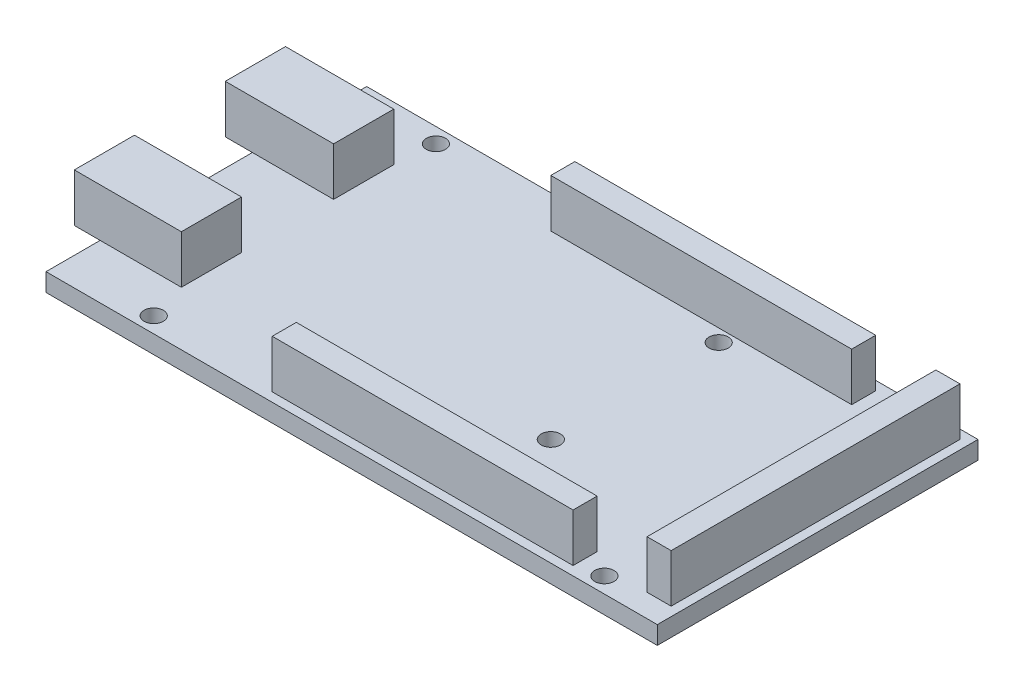
ISO-10303-21;
HEADER;
FILE_DESCRIPTION(('STEP AP214'),'2;1');
FILE_NAME('part.step','',(''),(''),'','','');
FILE_SCHEMA(('AUTOMOTIVE_DESIGN { 1 0 10303 214 1 1 1 1 }'));
ENDSEC;
DATA;
#1=APPLICATION_CONTEXT('core data for automotive mechanical design processes');
#2=APPLICATION_PROTOCOL_DEFINITION('international standard','automotive_design',2000,#1);
#3=PRODUCT_CONTEXT('',#1,'mechanical');
#4=PRODUCT('Part','Part','',(#3));
#5=PRODUCT_RELATED_PRODUCT_CATEGORY('part','',(#4));
#6=PRODUCT_DEFINITION_FORMATION('','',#4);
#7=PRODUCT_DEFINITION_CONTEXT('part definition',#1,'design');
#8=PRODUCT_DEFINITION('design','',#6,#7);
#9=PRODUCT_DEFINITION_SHAPE('','',#8);
#10=(LENGTH_UNIT() NAMED_UNIT(*) SI_UNIT(.MILLI.,.METRE.));
#11=(NAMED_UNIT(*) PLANE_ANGLE_UNIT() SI_UNIT($,.RADIAN.));
#12=(NAMED_UNIT(*) SI_UNIT($,.STERADIAN.) SOLID_ANGLE_UNIT());
#13=UNCERTAINTY_MEASURE_WITH_UNIT(LENGTH_MEASURE(1.E-05),#10,'distance_accuracy_value','');
#14=(GEOMETRIC_REPRESENTATION_CONTEXT(3) GLOBAL_UNCERTAINTY_ASSIGNED_CONTEXT((#13)) GLOBAL_UNIT_ASSIGNED_CONTEXT((#10,
#11,#12)) REPRESENTATION_CONTEXT('',''));
#15=CARTESIAN_POINT('',(0.,0.,0.));
#16=DIRECTION('',(0.,0.,1.));
#17=DIRECTION('',(1.,0.,0.));
#18=AXIS2_PLACEMENT_3D('',#15,#16,#17);
#19=CARTESIAN_POINT('',(0.,3.,0.));
#20=DIRECTION('',(0.,-1.,0.));
#21=DIRECTION('',(0.,0.,-1.));
#22=AXIS2_PLACEMENT_3D('',#19,#20,#21);
#23=PLANE('',#22);
#24=CARTESIAN_POINT('',(14.,3.,-50.8));
#25=DIRECTION('',(0.,-1.,0.));
#26=DIRECTION('',(0.,0.,-1.));
#27=AXIS2_PLACEMENT_3D('',#24,#25,#26);
#28=CIRCLE('',#27,1.59999999999999);
#29=CARTESIAN_POINT('',(14.,3.,-52.4));
#30=VERTEX_POINT('',#29);
#31=EDGE_CURVE('E898',#30,#30,#28,.T.);
#32=ORIENTED_EDGE('',*,*,#31,.T.);
#33=EDGE_LOOP('',(#32));
#34=FACE_BOUND('',#33,.T.);
#35=CARTESIAN_POINT('',(66.1,3.,-45.7));
#36=DIRECTION('',(0.,-1.,0.));
#37=DIRECTION('',(0.,0.,-1.));
#38=AXIS2_PLACEMENT_3D('',#35,#36,#37);
#39=CIRCLE('',#38,1.59999999999999);
#40=CARTESIAN_POINT('',(66.1,3.,-47.3));
#41=VERTEX_POINT('',#40);
#42=EDGE_CURVE('E905',#41,#41,#39,.T.);
#43=ORIENTED_EDGE('',*,*,#42,.T.);
#44=EDGE_LOOP('',(#43));
#45=FACE_BOUND('',#44,.T.);
#46=CARTESIAN_POINT('',(66.1,3.,-17.8));
#47=DIRECTION('',(0.,-1.,0.));
#48=DIRECTION('',(0.,0.,-1.));
#49=AXIS2_PLACEMENT_3D('',#46,#47,#48);
#50=CIRCLE('',#49,1.59999999999999);
#51=CARTESIAN_POINT('',(66.1,3.,-19.4));
#52=VERTEX_POINT('',#51);
#53=EDGE_CURVE('E916',#52,#52,#50,.T.);
#54=ORIENTED_EDGE('',*,*,#53,.T.);
#55=EDGE_LOOP('',(#54));
#56=FACE_BOUND('',#55,.T.);
#57=CARTESIAN_POINT('',(92.7,3.,-50.8));
#58=DIRECTION('',(0.,-1.,0.));
#59=DIRECTION('',(0.,0.,-1.));
#60=AXIS2_PLACEMENT_3D('',#57,#58,#59);
#61=CIRCLE('',#60,1.59999999999999);
#62=CARTESIAN_POINT('',(92.7,3.,-52.4));
#63=VERTEX_POINT('',#62);
#64=EDGE_CURVE('E923',#63,#63,#61,.T.);
#65=ORIENTED_EDGE('',*,*,#64,.T.);
#66=EDGE_LOOP('',(#65));
#67=FACE_BOUND('',#66,.T.);
#68=CARTESIAN_POINT('',(15.3,3.,-2.59999999999999));
#69=DIRECTION('',(0.,-1.,0.));
#70=DIRECTION('',(0.,0.,-1.));
#71=AXIS2_PLACEMENT_3D('',#68,#69,#70);
#72=CIRCLE('',#71,1.6);
#73=CARTESIAN_POINT('',(15.3,3.,-4.19999999999999));
#74=VERTEX_POINT('',#73);
#75=EDGE_CURVE('E43',#74,#74,#72,.T.);
#76=ORIENTED_EDGE('',*,*,#75,.T.);
#77=EDGE_LOOP('',(#76));
#78=FACE_BOUND('',#77,.T.);
#79=CARTESIAN_POINT('',(90.2,3.,-2.59999999999998));
#80=DIRECTION('',(0.,-1.,0.));
#81=DIRECTION('',(0.,0.,-1.));
#82=AXIS2_PLACEMENT_3D('',#79,#80,#81);
#83=CIRCLE('',#82,1.59999999999999);
#84=CARTESIAN_POINT('',(90.2,3.,-4.19999999999997));
#85=VERTEX_POINT('',#84);
#86=EDGE_CURVE('E471',#85,#85,#83,.T.);
#87=ORIENTED_EDGE('',*,*,#86,.T.);
#88=EDGE_LOOP('',(#87));
#89=FACE_BOUND('',#88,.T.);
#90=DIRECTION('',(0.,0.,1.));
#91=VECTOR('',#90,1.);
#92=CARTESIAN_POINT('',(36.1,3.,-5.50000000000002));
#93=LINE('',#92,#91);
#94=CARTESIAN_POINT('',(36.1,3.,-5.50000000000002));
#95=VERTEX_POINT('',#94);
#96=CARTESIAN_POINT('',(36.1,3.,-1.5));
#97=VERTEX_POINT('',#96);
#98=EDGE_CURVE('E244',#95,#97,#93,.T.);
#99=ORIENTED_EDGE('',*,*,#98,.F.);
#100=DIRECTION('',(-1.,0.,0.));
#101=VECTOR('',#100,1.);
#102=CARTESIAN_POINT('',(36.1,3.,-5.50000000000002));
#103=LINE('',#102,#101);
#104=CARTESIAN_POINT('',(86.1,3.,-5.50000000000002));
#105=VERTEX_POINT('',#104);
#106=EDGE_CURVE('E260',#105,#95,#103,.T.);
#107=ORIENTED_EDGE('',*,*,#106,.F.);
#108=DIRECTION('',(0.,0.,-1.));
#109=VECTOR('',#108,1.);
#110=CARTESIAN_POINT('',(86.1,3.,-5.50000000000002));
#111=LINE('',#110,#109);
#112=CARTESIAN_POINT('',(86.1,3.,-1.5));
#113=VERTEX_POINT('',#112);
#114=EDGE_CURVE('E273',#113,#105,#111,.T.);
#115=ORIENTED_EDGE('',*,*,#114,.F.);
#116=DIRECTION('',(1.,0.,0.));
#117=VECTOR('',#116,1.);
#118=CARTESIAN_POINT('',(36.1,3.,-1.5));
#119=LINE('',#118,#117);
#120=EDGE_CURVE('E249',#97,#113,#119,.T.);
#121=ORIENTED_EDGE('',*,*,#120,.F.);
#122=EDGE_LOOP('',(#99,#107,#115,#121));
#123=FACE_BOUND('',#122,.T.);
#124=DIRECTION('',(0.,0.,1.));
#125=VECTOR('',#124,1.);
#126=CARTESIAN_POINT('',(36.1,3.,-51.8));
#127=LINE('',#126,#125);
#128=CARTESIAN_POINT('',(36.1,3.,-51.8));
#129=VERTEX_POINT('',#128);
#130=CARTESIAN_POINT('',(36.1,3.,-47.8));
#131=VERTEX_POINT('',#130);
#132=EDGE_CURVE('E340',#129,#131,#127,.T.);
#133=ORIENTED_EDGE('',*,*,#132,.F.);
#134=DIRECTION('',(-1.,0.,0.));
#135=VECTOR('',#134,1.);
#136=CARTESIAN_POINT('',(36.1,3.,-51.8));
#137=LINE('',#136,#135);
#138=CARTESIAN_POINT('',(86.1,3.,-51.8));
#139=VERTEX_POINT('',#138);
#140=EDGE_CURVE('E346',#139,#129,#137,.T.);
#141=ORIENTED_EDGE('',*,*,#140,.F.);
#142=DIRECTION('',(0.,0.,-1.));
#143=VECTOR('',#142,1.);
#144=CARTESIAN_POINT('',(86.1,3.,-51.8));
#145=LINE('',#144,#143);
#146=CARTESIAN_POINT('',(86.1,3.,-47.8));
#147=VERTEX_POINT('',#146);
#148=EDGE_CURVE('E363',#147,#139,#145,.T.);
#149=ORIENTED_EDGE('',*,*,#148,.F.);
#150=DIRECTION('',(1.,0.,0.));
#151=VECTOR('',#150,1.);
#152=CARTESIAN_POINT('',(36.1,3.,-47.8));
#153=LINE('',#152,#151);
#154=EDGE_CURVE('E359',#131,#147,#153,.T.);
#155=ORIENTED_EDGE('',*,*,#154,.F.);
#156=EDGE_LOOP('',(#133,#141,#149,#155));
#157=FACE_BOUND('',#156,.T.);
#158=DIRECTION('',(0.,0.,1.));
#159=VECTOR('',#158,1.);
#160=CARTESIAN_POINT('',(96.1,3.,-51.8));
#161=LINE('',#160,#159);
#162=CARTESIAN_POINT('',(96.1,3.,-51.8));
#163=VERTEX_POINT('',#162);
#164=CARTESIAN_POINT('',(96.1,3.,-3.8));
#165=VERTEX_POINT('',#164);
#166=EDGE_CURVE('E295',#163,#165,#161,.T.);
#167=ORIENTED_EDGE('',*,*,#166,.F.);
#168=DIRECTION('',(-1.,0.,0.));
#169=VECTOR('',#168,1.);
#170=CARTESIAN_POINT('',(96.1,3.,-51.8));
#171=LINE('',#170,#169);
#172=CARTESIAN_POINT('',(100.1,3.,-51.8));
#173=VERTEX_POINT('',#172);
#174=EDGE_CURVE('E301',#173,#163,#171,.T.);
#175=ORIENTED_EDGE('',*,*,#174,.F.);
#176=DIRECTION('',(0.,0.,-1.));
#177=VECTOR('',#176,1.);
#178=CARTESIAN_POINT('',(100.1,3.,-51.8));
#179=LINE('',#178,#177);
#180=CARTESIAN_POINT('',(100.1,3.,-3.8));
#181=VERTEX_POINT('',#180);
#182=EDGE_CURVE('E318',#181,#173,#179,.T.);
#183=ORIENTED_EDGE('',*,*,#182,.F.);
#184=DIRECTION('',(1.,0.,0.));
#185=VECTOR('',#184,1.);
#186=CARTESIAN_POINT('',(96.1,3.,-3.8));
#187=LINE('',#186,#185);
#188=EDGE_CURVE('E314',#165,#181,#187,.T.);
#189=ORIENTED_EDGE('',*,*,#188,.F.);
#190=EDGE_LOOP('',(#167,#175,#183,#189));
#191=FACE_BOUND('',#190,.T.);
#192=DIRECTION('',(1.,0.,0.));
#193=VECTOR('',#192,1.);
#194=CARTESIAN_POINT('',(-4.29621012064984,3.,-9.));
#195=LINE('',#194,#193);
#196=CARTESIAN_POINT('',(0.,3.,-9.));
#197=VERTEX_POINT('',#196);
#198=CARTESIAN_POINT('',(13.5,3.,-9.));
#199=VERTEX_POINT('',#198);
#200=EDGE_CURVE('E479',#197,#199,#195,.T.);
#201=ORIENTED_EDGE('',*,*,#200,.F.);
#202=DIRECTION('',(0.,0.,1.));
#203=VECTOR('',#202,1.);
#204=CARTESIAN_POINT('',(0.,3.,0.));
#205=LINE('',#204,#203);
#206=CARTESIAN_POINT('',(0.,3.,0.));
#207=VERTEX_POINT('',#206);
#208=EDGE_CURVE('E436',#197,#207,#205,.T.);
#209=ORIENTED_EDGE('',*,*,#208,.T.);
#210=DIRECTION('',(1.,0.,0.));
#211=VECTOR('',#210,1.);
#212=CARTESIAN_POINT('',(0.,3.,0.));
#213=LINE('',#212,#211);
#214=CARTESIAN_POINT('',(101.6,3.,0.));
#215=VERTEX_POINT('',#214);
#216=EDGE_CURVE('E434',#207,#215,#213,.T.);
#217=ORIENTED_EDGE('',*,*,#216,.T.);
#218=DIRECTION('',(0.,0.,-1.));
#219=VECTOR('',#218,1.);
#220=CARTESIAN_POINT('',(101.6,3.,0.));
#221=LINE('',#220,#219);
#222=CARTESIAN_POINT('',(101.6,3.,-53.3));
#223=VERTEX_POINT('',#222);
#224=EDGE_CURVE('E439',#215,#223,#221,.T.);
#225=ORIENTED_EDGE('',*,*,#224,.T.);
#226=DIRECTION('',(-1.,0.,0.));
#227=VECTOR('',#226,1.);
#228=CARTESIAN_POINT('',(0.,3.,-53.3));
#229=LINE('',#228,#227);
#230=CARTESIAN_POINT('',(0.,3.,-53.3));
#231=VERTEX_POINT('',#230);
#232=EDGE_CURVE('E442',#223,#231,#229,.T.);
#233=ORIENTED_EDGE('',*,*,#232,.T.);
#234=CARTESIAN_POINT('',(0.,3.,-44.3));
#235=VERTEX_POINT('',#234);
#236=EDGE_CURVE('E430',#231,#235,#205,.T.);
#237=ORIENTED_EDGE('',*,*,#236,.T.);
#238=DIRECTION('',(-1.,0.,0.));
#239=VECTOR('',#238,1.);
#240=CARTESIAN_POINT('',(-4.50000000000003,3.,-44.3));
#241=LINE('',#240,#239);
#242=CARTESIAN_POINT('',(13.5,3.,-44.3));
#243=VERTEX_POINT('',#242);
#244=EDGE_CURVE('E391',#243,#235,#241,.T.);
#245=ORIENTED_EDGE('',*,*,#244,.F.);
#246=DIRECTION('',(0.,0.,-1.));
#247=VECTOR('',#246,1.);
#248=CARTESIAN_POINT('',(13.5,3.,-44.3));
#249=LINE('',#248,#247);
#250=CARTESIAN_POINT('',(13.5,3.,-34.3));
#251=VERTEX_POINT('',#250);
#252=EDGE_CURVE('E406',#251,#243,#249,.T.);
#253=ORIENTED_EDGE('',*,*,#252,.F.);
#254=DIRECTION('',(1.,0.,0.));
#255=VECTOR('',#254,1.);
#256=CARTESIAN_POINT('',(-4.50000000000002,3.,-34.3));
#257=LINE('',#256,#255);
#258=CARTESIAN_POINT('',(0.,3.,-34.3));
#259=VERTEX_POINT('',#258);
#260=EDGE_CURVE('E11',#259,#251,#257,.T.);
#261=ORIENTED_EDGE('',*,*,#260,.F.);
#262=CARTESIAN_POINT('',(0.,3.,-19.));
#263=VERTEX_POINT('',#262);
#264=EDGE_CURVE('E998',#259,#263,#205,.T.);
#265=ORIENTED_EDGE('',*,*,#264,.T.);
#266=DIRECTION('',(-1.,0.,0.));
#267=VECTOR('',#266,1.);
#268=CARTESIAN_POINT('',(-4.29621012064984,3.,-19.));
#269=LINE('',#268,#267);
#270=CARTESIAN_POINT('',(13.5,3.,-19.));
#271=VERTEX_POINT('',#270);
#272=EDGE_CURVE('E63',#271,#263,#269,.T.);
#273=ORIENTED_EDGE('',*,*,#272,.F.);
#274=DIRECTION('',(0.,0.,-1.));
#275=VECTOR('',#274,1.);
#276=CARTESIAN_POINT('',(13.5,3.,-19.));
#277=LINE('',#276,#275);
#278=EDGE_CURVE('E58',#199,#271,#277,.T.);
#279=ORIENTED_EDGE('',*,*,#278,.F.);
#280=EDGE_LOOP('',(#201,#209,#217,#225,#233,#237,#245,#253,#261,#265,#273,#279));
#281=FACE_BOUND('',#280,.T.);
#282=ADVANCED_FACE('F39',(#34,#45,#56,#67,#78,#89,#123,#157,#191,#281),#23,.F.);
#283=CARTESIAN_POINT('',(0.,3.,0.));
#284=DIRECTION('',(1.,0.,0.));
#285=DIRECTION('',(0.,0.,-1.));
#286=AXIS2_PLACEMENT_3D('',#283,#284,#285);
#287=PLANE('',#286);
#288=DIRECTION('',(0.,0.,1.));
#289=VECTOR('',#288,1.);
#290=CARTESIAN_POINT('',(0.,0.,0.));
#291=LINE('',#290,#289);
#292=CARTESIAN_POINT('',(0.,0.,-53.3));
#293=VERTEX_POINT('',#292);
#294=CARTESIAN_POINT('',(0.,0.,0.));
#295=VERTEX_POINT('',#294);
#296=EDGE_CURVE('E429',#293,#295,#291,.T.);
#297=ORIENTED_EDGE('',*,*,#296,.T.);
#298=DIRECTION('',(0.,-1.,0.));
#299=VECTOR('',#298,1.);
#300=CARTESIAN_POINT('',(0.,3.,0.));
#301=LINE('',#300,#299);
#302=EDGE_CURVE('E49',#207,#295,#301,.T.);
#303=ORIENTED_EDGE('',*,*,#302,.F.);
#304=ORIENTED_EDGE('',*,*,#208,.F.);
#305=EDGE_CURVE('E993',#263,#197,#205,.T.);
#306=ORIENTED_EDGE('',*,*,#305,.F.);
#307=ORIENTED_EDGE('',*,*,#264,.F.);
#308=EDGE_CURVE('E435',#235,#259,#205,.T.);
#309=ORIENTED_EDGE('',*,*,#308,.F.);
#310=ORIENTED_EDGE('',*,*,#236,.F.);
#311=DIRECTION('',(0.,-1.,0.));
#312=VECTOR('',#311,1.);
#313=CARTESIAN_POINT('',(0.,3.,-53.3));
#314=LINE('',#313,#312);
#315=EDGE_CURVE('E445',#231,#293,#314,.T.);
#316=ORIENTED_EDGE('',*,*,#315,.T.);
#317=EDGE_LOOP('',(#297,#303,#304,#306,#307,#309,#310,#316));
#318=FACE_BOUND('',#317,.T.);
#319=ADVANCED_FACE('F41',(#318),#287,.F.);
#320=CARTESIAN_POINT('',(0.,3.,0.));
#321=DIRECTION('',(0.,0.,-1.));
#322=DIRECTION('',(-1.,0.,0.));
#323=AXIS2_PLACEMENT_3D('',#320,#321,#322);
#324=PLANE('',#323);
#325=DIRECTION('',(1.,0.,0.));
#326=VECTOR('',#325,1.);
#327=CARTESIAN_POINT('',(0.,0.,0.));
#328=LINE('',#327,#326);
#329=CARTESIAN_POINT('',(101.6,0.,0.));
#330=VERTEX_POINT('',#329);
#331=EDGE_CURVE('E449',#295,#330,#328,.T.);
#332=ORIENTED_EDGE('',*,*,#331,.T.);
#333=DIRECTION('',(0.,-1.,0.));
#334=VECTOR('',#333,1.);
#335=CARTESIAN_POINT('',(101.6,3.,0.));
#336=LINE('',#335,#334);
#337=EDGE_CURVE('E465',#215,#330,#336,.T.);
#338=ORIENTED_EDGE('',*,*,#337,.F.);
#339=ORIENTED_EDGE('',*,*,#216,.F.);
#340=ORIENTED_EDGE('',*,*,#302,.T.);
#341=EDGE_LOOP('',(#332,#338,#339,#340));
#342=FACE_BOUND('',#341,.T.);
#343=ADVANCED_FACE('F526',(#342),#324,.F.);
#344=CARTESIAN_POINT('',(101.6,3.,0.));
#345=DIRECTION('',(-1.,0.,0.));
#346=DIRECTION('',(0.,0.,1.));
#347=AXIS2_PLACEMENT_3D('',#344,#345,#346);
#348=PLANE('',#347);
#349=DIRECTION('',(0.,0.,-1.));
#350=VECTOR('',#349,1.);
#351=CARTESIAN_POINT('',(101.6,0.,0.));
#352=LINE('',#351,#350);
#353=CARTESIAN_POINT('',(101.6,0.,-53.3));
#354=VERTEX_POINT('',#353);
#355=EDGE_CURVE('E452',#330,#354,#352,.T.);
#356=ORIENTED_EDGE('',*,*,#355,.T.);
#357=DIRECTION('',(0.,-1.,0.));
#358=VECTOR('',#357,1.);
#359=CARTESIAN_POINT('',(101.6,3.,-53.3));
#360=LINE('',#359,#358);
#361=EDGE_CURVE('E461',#223,#354,#360,.T.);
#362=ORIENTED_EDGE('',*,*,#361,.F.);
#363=ORIENTED_EDGE('',*,*,#224,.F.);
#364=ORIENTED_EDGE('',*,*,#337,.T.);
#365=EDGE_LOOP('',(#356,#362,#363,#364));
#366=FACE_BOUND('',#365,.T.);
#367=ADVANCED_FACE('F542',(#366),#348,.F.);
#368=CARTESIAN_POINT('',(0.,3.,-53.3));
#369=DIRECTION('',(0.,0.,1.));
#370=DIRECTION('',(1.,0.,0.));
#371=AXIS2_PLACEMENT_3D('',#368,#369,#370);
#372=PLANE('',#371);
#373=DIRECTION('',(-1.,0.,0.));
#374=VECTOR('',#373,1.);
#375=CARTESIAN_POINT('',(0.,0.,-53.3));
#376=LINE('',#375,#374);
#377=EDGE_CURVE('E455',#354,#293,#376,.T.);
#378=ORIENTED_EDGE('',*,*,#377,.T.);
#379=ORIENTED_EDGE('',*,*,#315,.F.);
#380=ORIENTED_EDGE('',*,*,#232,.F.);
#381=ORIENTED_EDGE('',*,*,#361,.T.);
#382=EDGE_LOOP('',(#378,#379,#380,#381));
#383=FACE_BOUND('',#382,.T.);
#384=ADVANCED_FACE('F538',(#383),#372,.F.);
#385=CARTESIAN_POINT('',(0.,0.,0.));
#386=DIRECTION('',(0.,-1.,0.));
#387=DIRECTION('',(0.,0.,-1.));
#388=AXIS2_PLACEMENT_3D('',#385,#386,#387);
#389=PLANE('',#388);
#390=CARTESIAN_POINT('',(14.,0.,-50.8));
#391=DIRECTION('',(0.,-1.,0.));
#392=DIRECTION('',(0.,0.,-1.));
#393=AXIS2_PLACEMENT_3D('',#390,#391,#392);
#394=CIRCLE('',#393,1.6);
#395=CARTESIAN_POINT('',(14.,0.,-52.4));
#396=VERTEX_POINT('',#395);
#397=EDGE_CURVE('E896',#396,#396,#394,.T.);
#398=ORIENTED_EDGE('',*,*,#397,.F.);
#399=EDGE_LOOP('',(#398));
#400=FACE_BOUND('',#399,.T.);
#401=CARTESIAN_POINT('',(66.1,0.,-45.7));
#402=DIRECTION('',(0.,-1.,0.));
#403=DIRECTION('',(0.,0.,-1.));
#404=AXIS2_PLACEMENT_3D('',#401,#402,#403);
#405=CIRCLE('',#404,1.59999999999999);
#406=CARTESIAN_POINT('',(66.1,0.,-47.3));
#407=VERTEX_POINT('',#406);
#408=EDGE_CURVE('E900',#407,#407,#405,.T.);
#409=ORIENTED_EDGE('',*,*,#408,.F.);
#410=EDGE_LOOP('',(#409));
#411=FACE_BOUND('',#410,.T.);
#412=CARTESIAN_POINT('',(66.1,0.,-17.8));
#413=DIRECTION('',(0.,-1.,0.));
#414=DIRECTION('',(0.,0.,-1.));
#415=AXIS2_PLACEMENT_3D('',#412,#413,#414);
#416=CIRCLE('',#415,1.59999999999999);
#417=CARTESIAN_POINT('',(66.1,0.,-19.4));
#418=VERTEX_POINT('',#417);
#419=EDGE_CURVE('E912',#418,#418,#416,.T.);
#420=ORIENTED_EDGE('',*,*,#419,.F.);
#421=EDGE_LOOP('',(#420));
#422=FACE_BOUND('',#421,.T.);
#423=CARTESIAN_POINT('',(92.7,0.,-50.8));
#424=DIRECTION('',(0.,-1.,0.));
#425=DIRECTION('',(0.,0.,-1.));
#426=AXIS2_PLACEMENT_3D('',#423,#424,#425);
#427=CIRCLE('',#426,1.59999999999999);
#428=CARTESIAN_POINT('',(92.7,0.,-52.4));
#429=VERTEX_POINT('',#428);
#430=EDGE_CURVE('E920',#429,#429,#427,.T.);
#431=ORIENTED_EDGE('',*,*,#430,.F.);
#432=EDGE_LOOP('',(#431));
#433=FACE_BOUND('',#432,.T.);
#434=CARTESIAN_POINT('',(15.3,0.,-2.59999999999999));
#435=DIRECTION('',(0.,-1.,0.));
#436=DIRECTION('',(0.,0.,-1.));
#437=AXIS2_PLACEMENT_3D('',#434,#435,#436);
#438=CIRCLE('',#437,1.6);
#439=CARTESIAN_POINT('',(15.3,0.,-4.19999999999999));
#440=VERTEX_POINT('',#439);
#441=EDGE_CURVE('E487',#440,#440,#438,.T.);
#442=ORIENTED_EDGE('',*,*,#441,.F.);
#443=EDGE_LOOP('',(#442));
#444=FACE_BOUND('',#443,.T.);
#445=CARTESIAN_POINT('',(90.2,0.,-2.59999999999998));
#446=DIRECTION('',(0.,-1.,0.));
#447=DIRECTION('',(0.,0.,-1.));
#448=AXIS2_PLACEMENT_3D('',#445,#446,#447);
#449=CIRCLE('',#448,1.59999999999999);
#450=CARTESIAN_POINT('',(90.2,0.,-4.19999999999997));
#451=VERTEX_POINT('',#450);
#452=EDGE_CURVE('E474',#451,#451,#449,.T.);
#453=ORIENTED_EDGE('',*,*,#452,.F.);
#454=EDGE_LOOP('',(#453));
#455=FACE_BOUND('',#454,.T.);
#456=ORIENTED_EDGE('',*,*,#296,.F.);
#457=ORIENTED_EDGE('',*,*,#377,.F.);
#458=ORIENTED_EDGE('',*,*,#355,.F.);
#459=ORIENTED_EDGE('',*,*,#331,.F.);
#460=EDGE_LOOP('',(#456,#457,#458,#459));
#461=FACE_BOUND('',#460,.T.);
#462=ADVANCED_FACE('F534',(#400,#411,#422,#433,#444,#455,#461),#389,.T.);
#463=CARTESIAN_POINT('',(0.,3.,0.));
#464=DIRECTION('',(0.,1.,0.));
#465=DIRECTION('',(0.,0.,1.));
#466=AXIS2_PLACEMENT_3D('',#463,#464,#465);
#467=PLANE('',#466);
#468=CARTESIAN_POINT('',(-4.50000000000003,3.,-44.3));
#469=VERTEX_POINT('',#468);
#470=EDGE_CURVE('E410',#235,#469,#241,.T.);
#471=ORIENTED_EDGE('',*,*,#470,.F.);
#472=ORIENTED_EDGE('',*,*,#308,.T.);
#473=CARTESIAN_POINT('',(-4.50000000000002,3.,-34.3));
#474=VERTEX_POINT('',#473);
#475=EDGE_CURVE('E51',#474,#259,#257,.T.);
#476=ORIENTED_EDGE('',*,*,#475,.F.);
#477=DIRECTION('',(0.,0.,1.));
#478=VECTOR('',#477,1.);
#479=CARTESIAN_POINT('',(-4.50000000000003,3.,-44.3));
#480=LINE('',#479,#478);
#481=EDGE_CURVE('E385',#469,#474,#480,.T.);
#482=ORIENTED_EDGE('',*,*,#481,.F.);
#483=EDGE_LOOP('',(#471,#472,#476,#482));
#484=FACE_BOUND('',#483,.T.);
#485=ADVANCED_FACE('F537',(#484),#467,.F.);
#486=CARTESIAN_POINT('',(-4.50000000000003,11.,-44.3));
#487=DIRECTION('',(1.,0.,0.));
#488=DIRECTION('',(0.,0.,-1.));
#489=AXIS2_PLACEMENT_3D('',#486,#487,#488);
#490=PLANE('',#489);
#491=ORIENTED_EDGE('',*,*,#481,.T.);
#492=DIRECTION('',(0.,-1.,0.));
#493=VECTOR('',#492,1.);
#494=CARTESIAN_POINT('',(-4.50000000000002,11.,-34.3));
#495=LINE('',#494,#493);
#496=CARTESIAN_POINT('',(-4.50000000000002,11.,-34.3));
#497=VERTEX_POINT('',#496);
#498=EDGE_CURVE('E425',#497,#474,#495,.T.);
#499=ORIENTED_EDGE('',*,*,#498,.F.);
#500=DIRECTION('',(0.,0.,1.));
#501=VECTOR('',#500,1.);
#502=CARTESIAN_POINT('',(-4.50000000000003,11.,-44.3));
#503=LINE('',#502,#501);
#504=CARTESIAN_POINT('',(-4.50000000000003,11.,-44.3));
#505=VERTEX_POINT('',#504);
#506=EDGE_CURVE('E386',#505,#497,#503,.T.);
#507=ORIENTED_EDGE('',*,*,#506,.F.);
#508=DIRECTION('',(0.,-1.,0.));
#509=VECTOR('',#508,1.);
#510=CARTESIAN_POINT('',(-4.50000000000003,11.,-44.3));
#511=LINE('',#510,#509);
#512=EDGE_CURVE('E400',#505,#469,#511,.T.);
#513=ORIENTED_EDGE('',*,*,#512,.T.);
#514=EDGE_LOOP('',(#491,#499,#507,#513));
#515=FACE_BOUND('',#514,.T.);
#516=ADVANCED_FACE('F532',(#515),#490,.F.);
#517=CARTESIAN_POINT('',(-4.50000000000002,11.,-34.3));
#518=DIRECTION('',(0.,0.,-1.));
#519=DIRECTION('',(-1.,0.,0.));
#520=AXIS2_PLACEMENT_3D('',#517,#518,#519);
#521=PLANE('',#520);
#522=ORIENTED_EDGE('',*,*,#475,.T.);
#523=ORIENTED_EDGE('',*,*,#260,.T.);
#524=DIRECTION('',(0.,-1.,0.));
#525=VECTOR('',#524,1.);
#526=CARTESIAN_POINT('',(13.5,11.,-34.3));
#527=LINE('',#526,#525);
#528=CARTESIAN_POINT('',(13.5,11.,-34.3));
#529=VERTEX_POINT('',#528);
#530=EDGE_CURVE('E421',#529,#251,#527,.T.);
#531=ORIENTED_EDGE('',*,*,#530,.F.);
#532=DIRECTION('',(1.,0.,0.));
#533=VECTOR('',#532,1.);
#534=CARTESIAN_POINT('',(-4.50000000000002,11.,-34.3));
#535=LINE('',#534,#533);
#536=EDGE_CURVE('E390',#497,#529,#535,.T.);
#537=ORIENTED_EDGE('',*,*,#536,.F.);
#538=ORIENTED_EDGE('',*,*,#498,.T.);
#539=EDGE_LOOP('',(#522,#523,#531,#537,#538));
#540=FACE_BOUND('',#539,.T.);
#541=ADVANCED_FACE('F578',(#540),#521,.F.);
#542=CARTESIAN_POINT('',(13.5,11.,-44.3));
#543=DIRECTION('',(-1.,0.,0.));
#544=DIRECTION('',(0.,0.,1.));
#545=AXIS2_PLACEMENT_3D('',#542,#543,#544);
#546=PLANE('',#545);
#547=ORIENTED_EDGE('',*,*,#252,.T.);
#548=DIRECTION('',(0.,-1.,0.));
#549=VECTOR('',#548,1.);
#550=CARTESIAN_POINT('',(13.5,11.,-44.3));
#551=LINE('',#550,#549);
#552=CARTESIAN_POINT('',(13.5,11.,-44.3));
#553=VERTEX_POINT('',#552);
#554=EDGE_CURVE('E417',#553,#243,#551,.T.);
#555=ORIENTED_EDGE('',*,*,#554,.F.);
#556=DIRECTION('',(0.,0.,-1.));
#557=VECTOR('',#556,1.);
#558=CARTESIAN_POINT('',(13.5,11.,-44.3));
#559=LINE('',#558,#557);
#560=EDGE_CURVE('E394',#529,#553,#559,.T.);
#561=ORIENTED_EDGE('',*,*,#560,.F.);
#562=ORIENTED_EDGE('',*,*,#530,.T.);
#563=EDGE_LOOP('',(#547,#555,#561,#562));
#564=FACE_BOUND('',#563,.T.);
#565=ADVANCED_FACE('F575',(#564),#546,.F.);
#566=CARTESIAN_POINT('',(-4.50000000000003,11.,-44.3));
#567=DIRECTION('',(0.,0.,1.));
#568=DIRECTION('',(1.,0.,0.));
#569=AXIS2_PLACEMENT_3D('',#566,#567,#568);
#570=PLANE('',#569);
#571=ORIENTED_EDGE('',*,*,#244,.T.);
#572=ORIENTED_EDGE('',*,*,#470,.T.);
#573=ORIENTED_EDGE('',*,*,#512,.F.);
#574=DIRECTION('',(-1.,0.,0.));
#575=VECTOR('',#574,1.);
#576=CARTESIAN_POINT('',(-4.50000000000003,11.,-44.3));
#577=LINE('',#576,#575);
#578=EDGE_CURVE('E397',#553,#505,#577,.T.);
#579=ORIENTED_EDGE('',*,*,#578,.F.);
#580=ORIENTED_EDGE('',*,*,#554,.T.);
#581=EDGE_LOOP('',(#571,#572,#573,#579,#580));
#582=FACE_BOUND('',#581,.T.);
#583=ADVANCED_FACE('F570',(#582),#570,.F.);
#584=CARTESIAN_POINT('',(0.,11.,0.));
#585=DIRECTION('',(0.,1.,0.));
#586=DIRECTION('',(0.,0.,1.));
#587=AXIS2_PLACEMENT_3D('',#584,#585,#586);
#588=PLANE('',#587);
#589=ORIENTED_EDGE('',*,*,#506,.T.);
#590=ORIENTED_EDGE('',*,*,#536,.T.);
#591=ORIENTED_EDGE('',*,*,#560,.T.);
#592=ORIENTED_EDGE('',*,*,#578,.T.);
#593=EDGE_LOOP('',(#589,#590,#591,#592));
#594=FACE_BOUND('',#593,.T.);
#595=ADVANCED_FACE('F583',(#594),#588,.T.);
#596=CARTESIAN_POINT('',(36.1,11.,-51.8));
#597=DIRECTION('',(1.,0.,0.));
#598=DIRECTION('',(0.,0.,-1.));
#599=AXIS2_PLACEMENT_3D('',#596,#597,#598);
#600=PLANE('',#599);
#601=ORIENTED_EDGE('',*,*,#132,.T.);
#602=DIRECTION('',(0.,-1.,0.));
#603=VECTOR('',#602,1.);
#604=CARTESIAN_POINT('',(36.1,11.,-47.8));
#605=LINE('',#604,#603);
#606=CARTESIAN_POINT('',(36.1,11.,-47.8));
#607=VERTEX_POINT('',#606);
#608=EDGE_CURVE('E381',#607,#131,#605,.T.);
#609=ORIENTED_EDGE('',*,*,#608,.F.);
#610=DIRECTION('',(0.,0.,1.));
#611=VECTOR('',#610,1.);
#612=CARTESIAN_POINT('',(36.1,11.,-51.8));
#613=LINE('',#612,#611);
#614=CARTESIAN_POINT('',(36.1,11.,-51.8));
#615=VERTEX_POINT('',#614);
#616=EDGE_CURVE('E341',#615,#607,#613,.T.);
#617=ORIENTED_EDGE('',*,*,#616,.F.);
#618=DIRECTION('',(0.,-1.,0.));
#619=VECTOR('',#618,1.);
#620=CARTESIAN_POINT('',(36.1,11.,-51.8));
#621=LINE('',#620,#619);
#622=EDGE_CURVE('E355',#615,#129,#621,.T.);
#623=ORIENTED_EDGE('',*,*,#622,.T.);
#624=EDGE_LOOP('',(#601,#609,#617,#623));
#625=FACE_BOUND('',#624,.T.);
#626=ADVANCED_FACE('F585',(#625),#600,.F.);
#627=CARTESIAN_POINT('',(36.1,11.,-47.8));
#628=DIRECTION('',(0.,0.,-1.));
#629=DIRECTION('',(-1.,0.,0.));
#630=AXIS2_PLACEMENT_3D('',#627,#628,#629);
#631=PLANE('',#630);
#632=ORIENTED_EDGE('',*,*,#154,.T.);
#633=DIRECTION('',(0.,-1.,0.));
#634=VECTOR('',#633,1.);
#635=CARTESIAN_POINT('',(86.1,11.,-47.8));
#636=LINE('',#635,#634);
#637=CARTESIAN_POINT('',(86.1,11.,-47.8));
#638=VERTEX_POINT('',#637);
#639=EDGE_CURVE('E377',#638,#147,#636,.T.);
#640=ORIENTED_EDGE('',*,*,#639,.F.);
#641=DIRECTION('',(1.,0.,0.));
#642=VECTOR('',#641,1.);
#643=CARTESIAN_POINT('',(36.1,11.,-47.8));
#644=LINE('',#643,#642);
#645=EDGE_CURVE('E345',#607,#638,#644,.T.);
#646=ORIENTED_EDGE('',*,*,#645,.F.);
#647=ORIENTED_EDGE('',*,*,#608,.T.);
#648=EDGE_LOOP('',(#632,#640,#646,#647));
#649=FACE_BOUND('',#648,.T.);
#650=ADVANCED_FACE('F591',(#649),#631,.F.);
#651=CARTESIAN_POINT('',(86.1,11.,-51.8));
#652=DIRECTION('',(-1.,0.,0.));
#653=DIRECTION('',(0.,0.,1.));
#654=AXIS2_PLACEMENT_3D('',#651,#652,#653);
#655=PLANE('',#654);
#656=ORIENTED_EDGE('',*,*,#148,.T.);
#657=DIRECTION('',(0.,-1.,0.));
#658=VECTOR('',#657,1.);
#659=CARTESIAN_POINT('',(86.1,11.,-51.8));
#660=LINE('',#659,#658);
#661=CARTESIAN_POINT('',(86.1,11.,-51.8));
#662=VERTEX_POINT('',#661);
#663=EDGE_CURVE('E373',#662,#139,#660,.T.);
#664=ORIENTED_EDGE('',*,*,#663,.F.);
#665=DIRECTION('',(0.,0.,-1.));
#666=VECTOR('',#665,1.);
#667=CARTESIAN_POINT('',(86.1,11.,-51.8));
#668=LINE('',#667,#666);
#669=EDGE_CURVE('E349',#638,#662,#668,.T.);
#670=ORIENTED_EDGE('',*,*,#669,.F.);
#671=ORIENTED_EDGE('',*,*,#639,.T.);
#672=EDGE_LOOP('',(#656,#664,#670,#671));
#673=FACE_BOUND('',#672,.T.);
#674=ADVANCED_FACE('F679',(#673),#655,.F.);
#675=CARTESIAN_POINT('',(36.1,11.,-51.8));
#676=DIRECTION('',(0.,0.,1.));
#677=DIRECTION('',(1.,0.,0.));
#678=AXIS2_PLACEMENT_3D('',#675,#676,#677);
#679=PLANE('',#678);
#680=ORIENTED_EDGE('',*,*,#140,.T.);
#681=ORIENTED_EDGE('',*,*,#622,.F.);
#682=DIRECTION('',(-1.,0.,0.));
#683=VECTOR('',#682,1.);
#684=CARTESIAN_POINT('',(36.1,11.,-51.8));
#685=LINE('',#684,#683);
#686=EDGE_CURVE('E352',#662,#615,#685,.T.);
#687=ORIENTED_EDGE('',*,*,#686,.F.);
#688=ORIENTED_EDGE('',*,*,#663,.T.);
#689=EDGE_LOOP('',(#680,#681,#687,#688));
#690=FACE_BOUND('',#689,.T.);
#691=ADVANCED_FACE('F687',(#690),#679,.F.);
#692=CARTESIAN_POINT('',(0.,11.,0.));
#693=DIRECTION('',(0.,1.,0.));
#694=DIRECTION('',(0.,0.,1.));
#695=AXIS2_PLACEMENT_3D('',#692,#693,#694);
#696=PLANE('',#695);
#697=ORIENTED_EDGE('',*,*,#616,.T.);
#698=ORIENTED_EDGE('',*,*,#645,.T.);
#699=ORIENTED_EDGE('',*,*,#669,.T.);
#700=ORIENTED_EDGE('',*,*,#686,.T.);
#701=EDGE_LOOP('',(#697,#698,#699,#700));
#702=FACE_BOUND('',#701,.T.);
#703=ADVANCED_FACE('F696',(#702),#696,.T.);
#704=CARTESIAN_POINT('',(96.1,11.,-51.8));
#705=DIRECTION('',(1.,0.,0.));
#706=DIRECTION('',(0.,0.,-1.));
#707=AXIS2_PLACEMENT_3D('',#704,#705,#706);
#708=PLANE('',#707);
#709=ORIENTED_EDGE('',*,*,#166,.T.);
#710=DIRECTION('',(0.,-1.,0.));
#711=VECTOR('',#710,1.);
#712=CARTESIAN_POINT('',(96.1,11.,-3.8));
#713=LINE('',#712,#711);
#714=CARTESIAN_POINT('',(96.1,11.,-3.8));
#715=VERTEX_POINT('',#714);
#716=EDGE_CURVE('E336',#715,#165,#713,.T.);
#717=ORIENTED_EDGE('',*,*,#716,.F.);
#718=DIRECTION('',(0.,0.,1.));
#719=VECTOR('',#718,1.);
#720=CARTESIAN_POINT('',(96.1,11.,-51.8));
#721=LINE('',#720,#719);
#722=CARTESIAN_POINT('',(96.1,11.,-51.8));
#723=VERTEX_POINT('',#722);
#724=EDGE_CURVE('E296',#723,#715,#721,.T.);
#725=ORIENTED_EDGE('',*,*,#724,.F.);
#726=DIRECTION('',(0.,-1.,0.));
#727=VECTOR('',#726,1.);
#728=CARTESIAN_POINT('',(96.1,11.,-51.8));
#729=LINE('',#728,#727);
#730=EDGE_CURVE('E310',#723,#163,#729,.T.);
#731=ORIENTED_EDGE('',*,*,#730,.T.);
#732=EDGE_LOOP('',(#709,#717,#725,#731));
#733=FACE_BOUND('',#732,.T.);
#734=ADVANCED_FACE('F705',(#733),#708,.F.);
#735=CARTESIAN_POINT('',(96.1,11.,-3.8));
#736=DIRECTION('',(0.,0.,-1.));
#737=DIRECTION('',(-1.,0.,0.));
#738=AXIS2_PLACEMENT_3D('',#735,#736,#737);
#739=PLANE('',#738);
#740=ORIENTED_EDGE('',*,*,#188,.T.);
#741=DIRECTION('',(0.,-1.,0.));
#742=VECTOR('',#741,1.);
#743=CARTESIAN_POINT('',(100.1,11.,-3.8));
#744=LINE('',#743,#742);
#745=CARTESIAN_POINT('',(100.1,11.,-3.8));
#746=VERTEX_POINT('',#745);
#747=EDGE_CURVE('E332',#746,#181,#744,.T.);
#748=ORIENTED_EDGE('',*,*,#747,.F.);
#749=DIRECTION('',(1.,0.,0.));
#750=VECTOR('',#749,1.);
#751=CARTESIAN_POINT('',(96.1,11.,-3.8));
#752=LINE('',#751,#750);
#753=EDGE_CURVE('E300',#715,#746,#752,.T.);
#754=ORIENTED_EDGE('',*,*,#753,.F.);
#755=ORIENTED_EDGE('',*,*,#716,.T.);
#756=EDGE_LOOP('',(#740,#748,#754,#755));
#757=FACE_BOUND('',#756,.T.);
#758=ADVANCED_FACE('F714',(#757),#739,.F.);
#759=CARTESIAN_POINT('',(100.1,11.,-51.8));
#760=DIRECTION('',(-1.,0.,0.));
#761=DIRECTION('',(0.,0.,1.));
#762=AXIS2_PLACEMENT_3D('',#759,#760,#761);
#763=PLANE('',#762);
#764=ORIENTED_EDGE('',*,*,#182,.T.);
#765=DIRECTION('',(0.,-1.,0.));
#766=VECTOR('',#765,1.);
#767=CARTESIAN_POINT('',(100.1,11.,-51.8));
#768=LINE('',#767,#766);
#769=CARTESIAN_POINT('',(100.1,11.,-51.8));
#770=VERTEX_POINT('',#769);
#771=EDGE_CURVE('E328',#770,#173,#768,.T.);
#772=ORIENTED_EDGE('',*,*,#771,.F.);
#773=DIRECTION('',(0.,0.,-1.));
#774=VECTOR('',#773,1.);
#775=CARTESIAN_POINT('',(100.1,11.,-51.8));
#776=LINE('',#775,#774);
#777=EDGE_CURVE('E304',#746,#770,#776,.T.);
#778=ORIENTED_EDGE('',*,*,#777,.F.);
#779=ORIENTED_EDGE('',*,*,#747,.T.);
#780=EDGE_LOOP('',(#764,#772,#778,#779));
#781=FACE_BOUND('',#780,.T.);
#782=ADVANCED_FACE('F723',(#781),#763,.F.);
#783=CARTESIAN_POINT('',(96.1,11.,-51.8));
#784=DIRECTION('',(0.,0.,1.));
#785=DIRECTION('',(1.,0.,0.));
#786=AXIS2_PLACEMENT_3D('',#783,#784,#785);
#787=PLANE('',#786);
#788=ORIENTED_EDGE('',*,*,#174,.T.);
#789=ORIENTED_EDGE('',*,*,#730,.F.);
#790=DIRECTION('',(-1.,0.,0.));
#791=VECTOR('',#790,1.);
#792=CARTESIAN_POINT('',(96.1,11.,-51.8));
#793=LINE('',#792,#791);
#794=EDGE_CURVE('E307',#770,#723,#793,.T.);
#795=ORIENTED_EDGE('',*,*,#794,.F.);
#796=ORIENTED_EDGE('',*,*,#771,.T.);
#797=EDGE_LOOP('',(#788,#789,#795,#796));
#798=FACE_BOUND('',#797,.T.);
#799=ADVANCED_FACE('F732',(#798),#787,.F.);
#800=CARTESIAN_POINT('',(0.,11.,0.));
#801=DIRECTION('',(0.,1.,0.));
#802=DIRECTION('',(0.,0.,1.));
#803=AXIS2_PLACEMENT_3D('',#800,#801,#802);
#804=PLANE('',#803);
#805=ORIENTED_EDGE('',*,*,#724,.T.);
#806=ORIENTED_EDGE('',*,*,#753,.T.);
#807=ORIENTED_EDGE('',*,*,#777,.T.);
#808=ORIENTED_EDGE('',*,*,#794,.T.);
#809=EDGE_LOOP('',(#805,#806,#807,#808));
#810=FACE_BOUND('',#809,.T.);
#811=ADVANCED_FACE('F741',(#810),#804,.T.);
#812=CARTESIAN_POINT('',(36.1,11.,-5.50000000000002));
#813=DIRECTION('',(1.,0.,0.));
#814=DIRECTION('',(0.,0.,-1.));
#815=AXIS2_PLACEMENT_3D('',#812,#813,#814);
#816=PLANE('',#815);
#817=ORIENTED_EDGE('',*,*,#98,.T.);
#818=DIRECTION('',(0.,-1.,0.));
#819=VECTOR('',#818,1.);
#820=CARTESIAN_POINT('',(36.1,11.,-1.5));
#821=LINE('',#820,#819);
#822=CARTESIAN_POINT('',(36.1,11.,-1.5));
#823=VERTEX_POINT('',#822);
#824=EDGE_CURVE('E291',#823,#97,#821,.T.);
#825=ORIENTED_EDGE('',*,*,#824,.F.);
#826=DIRECTION('',(0.,0.,1.));
#827=VECTOR('',#826,1.);
#828=CARTESIAN_POINT('',(36.1,11.,-5.50000000000002));
#829=LINE('',#828,#827);
#830=CARTESIAN_POINT('',(36.1,11.,-5.50000000000002));
#831=VERTEX_POINT('',#830);
#832=EDGE_CURVE('E255',#831,#823,#829,.T.);
#833=ORIENTED_EDGE('',*,*,#832,.F.);
#834=DIRECTION('',(0.,-1.,0.));
#835=VECTOR('',#834,1.);
#836=CARTESIAN_POINT('',(36.1,11.,-5.50000000000002));
#837=LINE('',#836,#835);
#838=EDGE_CURVE('E268',#831,#95,#837,.T.);
#839=ORIENTED_EDGE('',*,*,#838,.T.);
#840=EDGE_LOOP('',(#817,#825,#833,#839));
#841=FACE_BOUND('',#840,.T.);
#842=ADVANCED_FACE('F750',(#841),#816,.F.);
#843=CARTESIAN_POINT('',(36.1,11.,-1.5));
#844=DIRECTION('',(0.,0.,-1.));
#845=DIRECTION('',(-1.,0.,0.));
#846=AXIS2_PLACEMENT_3D('',#843,#844,#845);
#847=PLANE('',#846);
#848=ORIENTED_EDGE('',*,*,#120,.T.);
#849=DIRECTION('',(0.,-1.,0.));
#850=VECTOR('',#849,1.);
#851=CARTESIAN_POINT('',(86.1,11.,-1.5));
#852=LINE('',#851,#850);
#853=CARTESIAN_POINT('',(86.1,11.,-1.5));
#854=VERTEX_POINT('',#853);
#855=EDGE_CURVE('E287',#854,#113,#852,.T.);
#856=ORIENTED_EDGE('',*,*,#855,.F.);
#857=DIRECTION('',(1.,0.,0.));
#858=VECTOR('',#857,1.);
#859=CARTESIAN_POINT('',(36.1,11.,-1.5));
#860=LINE('',#859,#858);
#861=EDGE_CURVE('E259',#823,#854,#860,.T.);
#862=ORIENTED_EDGE('',*,*,#861,.F.);
#863=ORIENTED_EDGE('',*,*,#824,.T.);
#864=EDGE_LOOP('',(#848,#856,#862,#863));
#865=FACE_BOUND('',#864,.T.);
#866=ADVANCED_FACE('F759',(#865),#847,.F.);
#867=CARTESIAN_POINT('',(86.1,11.,-5.50000000000002));
#868=DIRECTION('',(-1.,0.,0.));
#869=DIRECTION('',(0.,0.,1.));
#870=AXIS2_PLACEMENT_3D('',#867,#868,#869);
#871=PLANE('',#870);
#872=ORIENTED_EDGE('',*,*,#114,.T.);
#873=DIRECTION('',(0.,-1.,0.));
#874=VECTOR('',#873,1.);
#875=CARTESIAN_POINT('',(86.1,11.,-5.50000000000002));
#876=LINE('',#875,#874);
#877=CARTESIAN_POINT('',(86.1,11.,-5.50000000000002));
#878=VERTEX_POINT('',#877);
#879=EDGE_CURVE('E283',#878,#105,#876,.T.);
#880=ORIENTED_EDGE('',*,*,#879,.F.);
#881=DIRECTION('',(0.,0.,-1.));
#882=VECTOR('',#881,1.);
#883=CARTESIAN_POINT('',(86.1,11.,-5.50000000000002));
#884=LINE('',#883,#882);
#885=EDGE_CURVE('E263',#854,#878,#884,.T.);
#886=ORIENTED_EDGE('',*,*,#885,.F.);
#887=ORIENTED_EDGE('',*,*,#855,.T.);
#888=EDGE_LOOP('',(#872,#880,#886,#887));
#889=FACE_BOUND('',#888,.T.);
#890=ADVANCED_FACE('F768',(#889),#871,.F.);
#891=CARTESIAN_POINT('',(36.1,11.,-5.50000000000002));
#892=DIRECTION('',(0.,0.,1.));
#893=DIRECTION('',(1.,0.,0.));
#894=AXIS2_PLACEMENT_3D('',#891,#892,#893);
#895=PLANE('',#894);
#896=ORIENTED_EDGE('',*,*,#106,.T.);
#897=ORIENTED_EDGE('',*,*,#838,.F.);
#898=DIRECTION('',(-1.,0.,0.));
#899=VECTOR('',#898,1.);
#900=CARTESIAN_POINT('',(36.1,11.,-5.50000000000002));
#901=LINE('',#900,#899);
#902=EDGE_CURVE('E266',#878,#831,#901,.T.);
#903=ORIENTED_EDGE('',*,*,#902,.F.);
#904=ORIENTED_EDGE('',*,*,#879,.T.);
#905=EDGE_LOOP('',(#896,#897,#903,#904));
#906=FACE_BOUND('',#905,.T.);
#907=ADVANCED_FACE('F777',(#906),#895,.F.);
#908=CARTESIAN_POINT('',(0.,11.,0.));
#909=DIRECTION('',(0.,1.,0.));
#910=DIRECTION('',(0.,0.,1.));
#911=AXIS2_PLACEMENT_3D('',#908,#909,#910);
#912=PLANE('',#911);
#913=ORIENTED_EDGE('',*,*,#832,.T.);
#914=ORIENTED_EDGE('',*,*,#861,.T.);
#915=ORIENTED_EDGE('',*,*,#885,.T.);
#916=ORIENTED_EDGE('',*,*,#902,.T.);
#917=EDGE_LOOP('',(#913,#914,#915,#916));
#918=FACE_BOUND('',#917,.T.);
#919=ADVANCED_FACE('F786',(#918),#912,.T.);
#920=CARTESIAN_POINT('',(0.,3.,0.));
#921=DIRECTION('',(0.,1.,0.));
#922=DIRECTION('',(0.,0.,1.));
#923=AXIS2_PLACEMENT_3D('',#920,#921,#922);
#924=PLANE('',#923);
#925=CARTESIAN_POINT('',(-4.29621012064984,3.,-19.));
#926=VERTEX_POINT('',#925);
#927=EDGE_CURVE('E501',#263,#926,#269,.T.);
#928=ORIENTED_EDGE('',*,*,#927,.F.);
#929=ORIENTED_EDGE('',*,*,#305,.T.);
#930=CARTESIAN_POINT('',(-4.29621012064984,3.,-9.));
#931=VERTEX_POINT('',#930);
#932=EDGE_CURVE('E496',#931,#197,#195,.T.);
#933=ORIENTED_EDGE('',*,*,#932,.F.);
#934=DIRECTION('',(0.,0.,1.));
#935=VECTOR('',#934,1.);
#936=CARTESIAN_POINT('',(-4.29621012064984,3.,-19.));
#937=LINE('',#936,#935);
#938=EDGE_CURVE('E242',#926,#931,#937,.T.);
#939=ORIENTED_EDGE('',*,*,#938,.F.);
#940=EDGE_LOOP('',(#928,#929,#933,#939));
#941=FACE_BOUND('',#940,.T.);
#942=ADVANCED_FACE('F795',(#941),#924,.F.);
#943=CARTESIAN_POINT('',(-4.29621012064984,11.,-19.));
#944=DIRECTION('',(1.,0.,0.));
#945=DIRECTION('',(0.,0.,-1.));
#946=AXIS2_PLACEMENT_3D('',#943,#944,#945);
#947=PLANE('',#946);
#948=ORIENTED_EDGE('',*,*,#938,.T.);
#949=DIRECTION('',(0.,-1.,0.));
#950=VECTOR('',#949,1.);
#951=CARTESIAN_POINT('',(-4.29621012064984,11.,-9.));
#952=LINE('',#951,#950);
#953=CARTESIAN_POINT('',(-4.29621012064984,11.,-9.));
#954=VERTEX_POINT('',#953);
#955=EDGE_CURVE('E221',#954,#931,#952,.T.);
#956=ORIENTED_EDGE('',*,*,#955,.F.);
#957=DIRECTION('',(0.,0.,1.));
#958=VECTOR('',#957,1.);
#959=CARTESIAN_POINT('',(-4.29621012064984,11.,-19.));
#960=LINE('',#959,#958);
#961=CARTESIAN_POINT('',(-4.29621012064984,11.,-19.));
#962=VERTEX_POINT('',#961);
#963=EDGE_CURVE('E229',#962,#954,#960,.T.);
#964=ORIENTED_EDGE('',*,*,#963,.F.);
#965=DIRECTION('',(0.,-1.,0.));
#966=VECTOR('',#965,1.);
#967=CARTESIAN_POINT('',(-4.29621012064984,11.,-19.));
#968=LINE('',#967,#966);
#969=EDGE_CURVE('E494',#962,#926,#968,.T.);
#970=ORIENTED_EDGE('',*,*,#969,.T.);
#971=EDGE_LOOP('',(#948,#956,#964,#970));
#972=FACE_BOUND('',#971,.T.);
#973=ADVANCED_FACE('F240',(#972),#947,.F.);
#974=CARTESIAN_POINT('',(-4.29621012064984,11.,-9.));
#975=DIRECTION('',(0.,0.,-1.));
#976=DIRECTION('',(-1.,0.,0.));
#977=AXIS2_PLACEMENT_3D('',#974,#975,#976);
#978=PLANE('',#977);
#979=ORIENTED_EDGE('',*,*,#932,.T.);
#980=ORIENTED_EDGE('',*,*,#200,.T.);
#981=DIRECTION('',(0.,-1.,0.));
#982=VECTOR('',#981,1.);
#983=CARTESIAN_POINT('',(13.5,11.,-9.));
#984=LINE('',#983,#982);
#985=CARTESIAN_POINT('',(13.5,11.,-9.));
#986=VERTEX_POINT('',#985);
#987=EDGE_CURVE('E224',#986,#199,#984,.T.);
#988=ORIENTED_EDGE('',*,*,#987,.F.);
#989=DIRECTION('',(1.,0.,0.));
#990=VECTOR('',#989,1.);
#991=CARTESIAN_POINT('',(-4.29621012064984,11.,-9.));
#992=LINE('',#991,#990);
#993=EDGE_CURVE('E216',#954,#986,#992,.T.);
#994=ORIENTED_EDGE('',*,*,#993,.F.);
#995=ORIENTED_EDGE('',*,*,#955,.T.);
#996=EDGE_LOOP('',(#979,#980,#988,#994,#995));
#997=FACE_BOUND('',#996,.T.);
#998=ADVANCED_FACE('F219',(#997),#978,.F.);
#999=CARTESIAN_POINT('',(13.5,11.,-19.));
#1000=DIRECTION('',(-1.,0.,0.));
#1001=DIRECTION('',(0.,0.,1.));
#1002=AXIS2_PLACEMENT_3D('',#999,#1000,#1001);
#1003=PLANE('',#1002);
#1004=ORIENTED_EDGE('',*,*,#278,.T.);
#1005=DIRECTION('',(0.,-1.,0.));
#1006=VECTOR('',#1005,1.);
#1007=CARTESIAN_POINT('',(13.5,11.,-19.));
#1008=LINE('',#1007,#1006);
#1009=CARTESIAN_POINT('',(13.5,11.,-19.));
#1010=VERTEX_POINT('',#1009);
#1011=EDGE_CURVE('E251',#1010,#271,#1008,.T.);
#1012=ORIENTED_EDGE('',*,*,#1011,.F.);
#1013=DIRECTION('',(0.,0.,-1.));
#1014=VECTOR('',#1013,1.);
#1015=CARTESIAN_POINT('',(13.5,11.,-19.));
#1016=LINE('',#1015,#1014);
#1017=EDGE_CURVE('E228',#986,#1010,#1016,.T.);
#1018=ORIENTED_EDGE('',*,*,#1017,.F.);
#1019=ORIENTED_EDGE('',*,*,#987,.T.);
#1020=EDGE_LOOP('',(#1004,#1012,#1018,#1019));
#1021=FACE_BOUND('',#1020,.T.);
#1022=ADVANCED_FACE('F511',(#1021),#1003,.F.);
#1023=CARTESIAN_POINT('',(-4.29621012064984,11.,-19.));
#1024=DIRECTION('',(0.,0.,1.));
#1025=DIRECTION('',(1.,0.,0.));
#1026=AXIS2_PLACEMENT_3D('',#1023,#1024,#1025);
#1027=PLANE('',#1026);
#1028=ORIENTED_EDGE('',*,*,#272,.T.);
#1029=ORIENTED_EDGE('',*,*,#927,.T.);
#1030=ORIENTED_EDGE('',*,*,#969,.F.);
#1031=DIRECTION('',(-1.,0.,0.));
#1032=VECTOR('',#1031,1.);
#1033=CARTESIAN_POINT('',(-4.29621012064984,11.,-19.));
#1034=LINE('',#1033,#1032);
#1035=EDGE_CURVE('E234',#1010,#962,#1034,.T.);
#1036=ORIENTED_EDGE('',*,*,#1035,.F.);
#1037=ORIENTED_EDGE('',*,*,#1011,.T.);
#1038=EDGE_LOOP('',(#1028,#1029,#1030,#1036,#1037));
#1039=FACE_BOUND('',#1038,.T.);
#1040=ADVANCED_FACE('F509',(#1039),#1027,.F.);
#1041=CARTESIAN_POINT('',(0.,11.,0.));
#1042=DIRECTION('',(0.,1.,0.));
#1043=DIRECTION('',(0.,0.,1.));
#1044=AXIS2_PLACEMENT_3D('',#1041,#1042,#1043);
#1045=PLANE('',#1044);
#1046=ORIENTED_EDGE('',*,*,#963,.T.);
#1047=ORIENTED_EDGE('',*,*,#993,.T.);
#1048=ORIENTED_EDGE('',*,*,#1017,.T.);
#1049=ORIENTED_EDGE('',*,*,#1035,.T.);
#1050=EDGE_LOOP('',(#1046,#1047,#1048,#1049));
#1051=FACE_BOUND('',#1050,.T.);
#1052=ADVANCED_FACE('F232',(#1051),#1045,.T.);
#1053=CARTESIAN_POINT('',(90.2,0.,-2.59999999999998));
#1054=DIRECTION('',(0.,-1.,0.));
#1055=DIRECTION('',(0.,0.,-1.));
#1056=AXIS2_PLACEMENT_3D('',#1053,#1054,#1055);
#1057=CYLINDRICAL_SURFACE('',#1056,1.59999999999999);
#1058=ORIENTED_EDGE('',*,*,#452,.T.);
#1059=EDGE_LOOP('',(#1058));
#1060=FACE_BOUND('',#1059,.T.);
#1061=ORIENTED_EDGE('',*,*,#86,.F.);
#1062=EDGE_LOOP('',(#1061));
#1063=FACE_BOUND('',#1062,.T.);
#1064=ADVANCED_FACE('F832',(#1060,#1063),#1057,.F.);
#1065=CARTESIAN_POINT('',(15.3,0.,-2.59999999999999));
#1066=DIRECTION('',(0.,-1.,0.));
#1067=DIRECTION('',(0.,0.,-1.));
#1068=AXIS2_PLACEMENT_3D('',#1065,#1066,#1067);
#1069=CYLINDRICAL_SURFACE('',#1068,1.6);
#1070=ORIENTED_EDGE('',*,*,#441,.T.);
#1071=EDGE_LOOP('',(#1070));
#1072=FACE_BOUND('',#1071,.T.);
#1073=ORIENTED_EDGE('',*,*,#75,.F.);
#1074=EDGE_LOOP('',(#1073));
#1075=FACE_BOUND('',#1074,.T.);
#1076=ADVANCED_FACE('F839',(#1072,#1075),#1069,.F.);
#1077=CARTESIAN_POINT('',(92.7,0.,-50.8));
#1078=DIRECTION('',(0.,-1.,0.));
#1079=DIRECTION('',(0.,0.,-1.));
#1080=AXIS2_PLACEMENT_3D('',#1077,#1078,#1079);
#1081=CYLINDRICAL_SURFACE('',#1080,1.59999999999999);
#1082=ORIENTED_EDGE('',*,*,#430,.T.);
#1083=EDGE_LOOP('',(#1082));
#1084=FACE_BOUND('',#1083,.T.);
#1085=ORIENTED_EDGE('',*,*,#64,.F.);
#1086=EDGE_LOOP('',(#1085));
#1087=FACE_BOUND('',#1086,.T.);
#1088=ADVANCED_FACE('F847',(#1084,#1087),#1081,.F.);
#1089=CARTESIAN_POINT('',(66.1,0.,-17.8));
#1090=DIRECTION('',(0.,-1.,0.));
#1091=DIRECTION('',(0.,0.,-1.));
#1092=AXIS2_PLACEMENT_3D('',#1089,#1090,#1091);
#1093=CYLINDRICAL_SURFACE('',#1092,1.59999999999999);
#1094=ORIENTED_EDGE('',*,*,#419,.T.);
#1095=EDGE_LOOP('',(#1094));
#1096=FACE_BOUND('',#1095,.T.);
#1097=ORIENTED_EDGE('',*,*,#53,.F.);
#1098=EDGE_LOOP('',(#1097));
#1099=FACE_BOUND('',#1098,.T.);
#1100=ADVANCED_FACE('F856',(#1096,#1099),#1093,.F.);
#1101=CARTESIAN_POINT('',(66.1,0.,-45.7));
#1102=DIRECTION('',(0.,-1.,0.));
#1103=DIRECTION('',(0.,0.,-1.));
#1104=AXIS2_PLACEMENT_3D('',#1101,#1102,#1103);
#1105=CYLINDRICAL_SURFACE('',#1104,1.59999999999999);
#1106=ORIENTED_EDGE('',*,*,#408,.T.);
#1107=EDGE_LOOP('',(#1106));
#1108=FACE_BOUND('',#1107,.T.);
#1109=ORIENTED_EDGE('',*,*,#42,.F.);
#1110=EDGE_LOOP('',(#1109));
#1111=FACE_BOUND('',#1110,.T.);
#1112=ADVANCED_FACE('F865',(#1108,#1111),#1105,.F.);
#1113=CARTESIAN_POINT('',(14.,0.,-50.8));
#1114=DIRECTION('',(0.,-1.,0.));
#1115=DIRECTION('',(0.,0.,-1.));
#1116=AXIS2_PLACEMENT_3D('',#1113,#1114,#1115);
#1117=CYLINDRICAL_SURFACE('',#1116,1.59999999999999);
#1118=ORIENTED_EDGE('',*,*,#397,.T.);
#1119=EDGE_LOOP('',(#1118));
#1120=FACE_BOUND('',#1119,.T.);
#1121=ORIENTED_EDGE('',*,*,#31,.F.);
#1122=EDGE_LOOP('',(#1121));
#1123=FACE_BOUND('',#1122,.T.);
#1124=ADVANCED_FACE('F874',(#1120,#1123),#1117,.F.);
#1125=CLOSED_SHELL('',(#282,#319,#343,#367,#384,#462,#485,#516,#541,#565,#583,#595,#626,#650,
#674,#691,#703,#734,#758,#782,#799,#811,#842,#866,#890,#907,#919,#942,#973,#998,#1022,#1040,
#1052,#1064,#1076,#1088,#1100,#1112,#1124));
#1126=MANIFOLD_SOLID_BREP('B2',#1125);
#1127=ADVANCED_BREP_SHAPE_REPRESENTATION('',(#18,#1126),#14);
#1128=SHAPE_DEFINITION_REPRESENTATION(#9,#1127);
ENDSEC;
END-ISO-10303-21;
